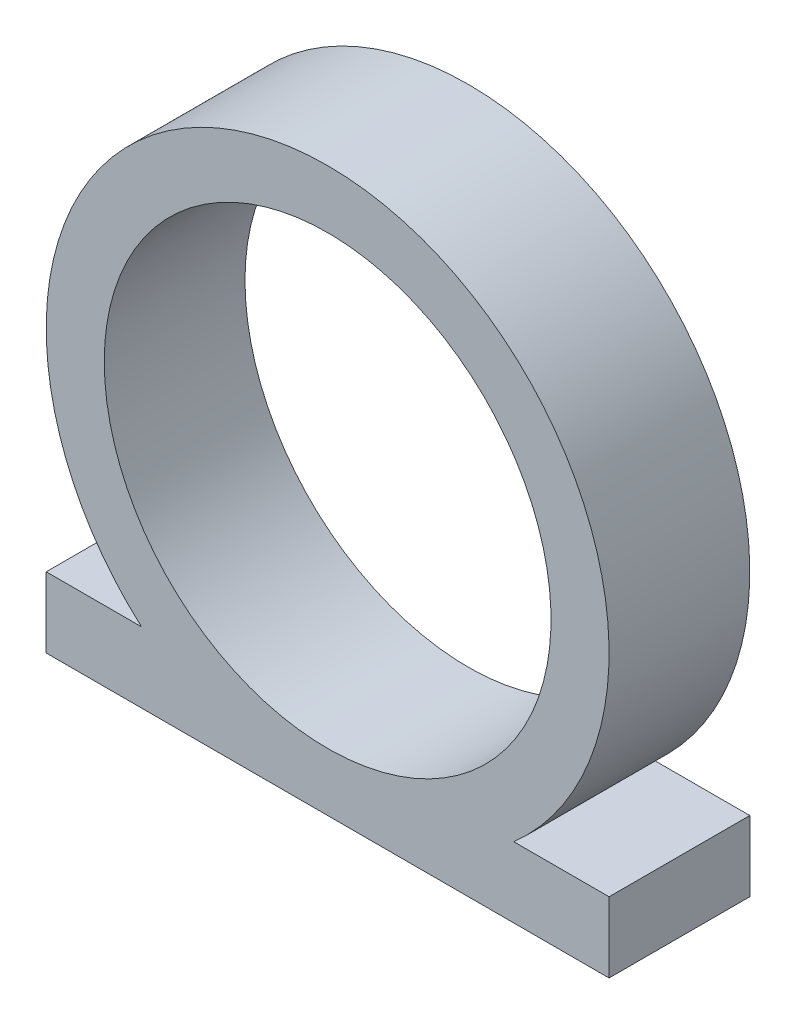
ISO-10303-21;
HEADER;
FILE_DESCRIPTION(('STEP AP214'),'2;1');
FILE_NAME('part.step','',(''),(''),'','','');
FILE_SCHEMA(('AUTOMOTIVE_DESIGN { 1 0 10303 214 1 1 1 1 }'));
ENDSEC;
DATA;
#1=APPLICATION_CONTEXT('core data for automotive mechanical design processes');
#2=APPLICATION_PROTOCOL_DEFINITION('international standard','automotive_design',2000,#1);
#3=PRODUCT_CONTEXT('',#1,'mechanical');
#4=PRODUCT('Part','Part','',(#3));
#5=PRODUCT_RELATED_PRODUCT_CATEGORY('part','',(#4));
#6=PRODUCT_DEFINITION_FORMATION('','',#4);
#7=PRODUCT_DEFINITION_CONTEXT('part definition',#1,'design');
#8=PRODUCT_DEFINITION('design','',#6,#7);
#9=PRODUCT_DEFINITION_SHAPE('','',#8);
#10=(LENGTH_UNIT() NAMED_UNIT(*) SI_UNIT(.MILLI.,.METRE.));
#11=(NAMED_UNIT(*) PLANE_ANGLE_UNIT() SI_UNIT($,.RADIAN.));
#12=(NAMED_UNIT(*) SI_UNIT($,.STERADIAN.) SOLID_ANGLE_UNIT());
#13=UNCERTAINTY_MEASURE_WITH_UNIT(LENGTH_MEASURE(1.E-05),#10,'distance_accuracy_value','');
#14=(GEOMETRIC_REPRESENTATION_CONTEXT(3) GLOBAL_UNCERTAINTY_ASSIGNED_CONTEXT((#13)) GLOBAL_UNIT_ASSIGNED_CONTEXT((#10,
#11,#12)) REPRESENTATION_CONTEXT('',''));
#15=CARTESIAN_POINT('',(0.,0.,0.));
#16=DIRECTION('',(0.,0.,1.));
#17=DIRECTION('',(1.,0.,0.));
#18=AXIS2_PLACEMENT_3D('',#15,#16,#17);
#19=CARTESIAN_POINT('',(0.,0.,10.));
#20=DIRECTION('',(0.,0.,-1.));
#21=DIRECTION('',(-1.,0.,0.));
#22=AXIS2_PLACEMENT_3D('',#19,#20,#21);
#23=CYLINDRICAL_SURFACE('',#22,20.);
#24=CARTESIAN_POINT('',(0.,0.,10.));
#25=DIRECTION('',(0.,0.,1.));
#26=DIRECTION('',(1.,0.,0.));
#27=AXIS2_PLACEMENT_3D('',#24,#25,#26);
#28=CIRCLE('',#27,20.);
#29=CARTESIAN_POINT('',(13.228756555323,-15.,10.));
#30=VERTEX_POINT('',#29);
#31=CARTESIAN_POINT('',(-13.228756555323,-15.,10.));
#32=VERTEX_POINT('',#31);
#33=EDGE_CURVE('E11',#30,#32,#28,.T.);
#34=ORIENTED_EDGE('',*,*,#33,.F.);
#35=DIRECTION('',(0.,0.,-1.));
#36=VECTOR('',#35,1.);
#37=CARTESIAN_POINT('',(13.228756555323,-15.,10.));
#38=LINE('',#37,#36);
#39=CARTESIAN_POINT('',(13.228756555323,-15.,0.));
#40=VERTEX_POINT('',#39);
#41=EDGE_CURVE('E132',#30,#40,#38,.T.);
#42=ORIENTED_EDGE('',*,*,#41,.T.);
#43=CARTESIAN_POINT('',(0.,0.,0.));
#44=DIRECTION('',(0.,0.,1.));
#45=DIRECTION('',(1.,0.,0.));
#46=AXIS2_PLACEMENT_3D('',#43,#44,#45);
#47=CIRCLE('',#46,20.);
#48=CARTESIAN_POINT('',(-13.228756555323,-15.,0.));
#49=VERTEX_POINT('',#48);
#50=EDGE_CURVE('E36',#40,#49,#47,.T.);
#51=ORIENTED_EDGE('',*,*,#50,.T.);
#52=DIRECTION('',(0.,0.,-1.));
#53=VECTOR('',#52,1.);
#54=CARTESIAN_POINT('',(-13.228756555323,-15.,10.));
#55=LINE('',#54,#53);
#56=EDGE_CURVE('E50',#49,#32,#55,.F.);
#57=ORIENTED_EDGE('',*,*,#56,.T.);
#58=EDGE_LOOP('',(#34,#42,#51,#57));
#59=FACE_BOUND('',#58,.T.);
#60=ADVANCED_FACE('F33',(#59),#23,.T.);
#61=CARTESIAN_POINT('',(0.,0.,10.));
#62=DIRECTION('',(0.,0.,1.));
#63=DIRECTION('',(1.,0.,0.));
#64=AXIS2_PLACEMENT_3D('',#61,#62,#63);
#65=PLANE('',#64);
#66=CARTESIAN_POINT('',(0.,0.,10.));
#67=DIRECTION('',(0.,0.,-1.));
#68=DIRECTION('',(-1.,0.,0.));
#69=AXIS2_PLACEMENT_3D('',#66,#67,#68);
#70=CIRCLE('',#69,15.875);
#71=CARTESIAN_POINT('',(-15.875,0.,10.));
#72=VERTEX_POINT('',#71);
#73=EDGE_CURVE('E121',#72,#72,#70,.T.);
#74=ORIENTED_EDGE('',*,*,#73,.T.);
#75=EDGE_LOOP('',(#74));
#76=FACE_BOUND('',#75,.T.);
#77=ORIENTED_EDGE('',*,*,#33,.T.);
#78=DIRECTION('',(1.,0.,0.));
#79=VECTOR('',#78,1.);
#80=CARTESIAN_POINT('',(-20.,-15.,10.));
#81=LINE('',#80,#79);
#82=CARTESIAN_POINT('',(-20.,-15.,10.));
#83=VERTEX_POINT('',#82);
#84=EDGE_CURVE('E85',#83,#32,#81,.T.);
#85=ORIENTED_EDGE('',*,*,#84,.F.);
#86=DIRECTION('',(0.,1.,0.));
#87=VECTOR('',#86,1.);
#88=CARTESIAN_POINT('',(-20.,-15.,10.));
#89=LINE('',#88,#87);
#90=CARTESIAN_POINT('',(-20.,-20.,10.));
#91=VERTEX_POINT('',#90);
#92=EDGE_CURVE('E98',#91,#83,#89,.T.);
#93=ORIENTED_EDGE('',*,*,#92,.F.);
#94=DIRECTION('',(-1.,0.,0.));
#95=VECTOR('',#94,1.);
#96=CARTESIAN_POINT('',(-20.,-20.,10.));
#97=LINE('',#96,#95);
#98=CARTESIAN_POINT('',(20.,-20.,10.));
#99=VERTEX_POINT('',#98);
#100=EDGE_CURVE('E93',#99,#91,#97,.T.);
#101=ORIENTED_EDGE('',*,*,#100,.F.);
#102=DIRECTION('',(0.,-1.,0.));
#103=VECTOR('',#102,1.);
#104=CARTESIAN_POINT('',(20.,-15.,10.));
#105=LINE('',#104,#103);
#106=CARTESIAN_POINT('',(20.,-15.,10.));
#107=VERTEX_POINT('',#106);
#108=EDGE_CURVE('E100',#107,#99,#105,.T.);
#109=ORIENTED_EDGE('',*,*,#108,.F.);
#110=EDGE_CURVE('E101',#30,#107,#81,.T.);
#111=ORIENTED_EDGE('',*,*,#110,.F.);
#112=EDGE_LOOP('',(#77,#85,#93,#101,#109,#111));
#113=FACE_BOUND('',#112,.T.);
#114=ADVANCED_FACE('F97',(#76,#113),#65,.T.);
#115=CARTESIAN_POINT('',(0.,0.,0.));
#116=DIRECTION('',(0.,0.,1.));
#117=DIRECTION('',(1.,0.,0.));
#118=AXIS2_PLACEMENT_3D('',#115,#116,#117);
#119=PLANE('',#118);
#120=CARTESIAN_POINT('',(0.,0.,0.));
#121=DIRECTION('',(0.,0.,-1.));
#122=DIRECTION('',(-1.,0.,0.));
#123=AXIS2_PLACEMENT_3D('',#120,#121,#122);
#124=CIRCLE('',#123,15.875);
#125=CARTESIAN_POINT('',(-15.875,0.,0.));
#126=VERTEX_POINT('',#125);
#127=EDGE_CURVE('E112',#126,#126,#124,.T.);
#128=ORIENTED_EDGE('',*,*,#127,.F.);
#129=EDGE_LOOP('',(#128));
#130=FACE_BOUND('',#129,.T.);
#131=ORIENTED_EDGE('',*,*,#50,.F.);
#132=DIRECTION('',(1.,0.,0.));
#133=VECTOR('',#132,1.);
#134=CARTESIAN_POINT('',(-20.,-15.,0.));
#135=LINE('',#134,#133);
#136=CARTESIAN_POINT('',(20.,-15.,0.));
#137=VERTEX_POINT('',#136);
#138=EDGE_CURVE('E120',#40,#137,#135,.T.);
#139=ORIENTED_EDGE('',*,*,#138,.T.);
#140=DIRECTION('',(0.,-1.,0.));
#141=VECTOR('',#140,1.);
#142=CARTESIAN_POINT('',(20.,-15.,0.));
#143=LINE('',#142,#141);
#144=CARTESIAN_POINT('',(20.,-20.,0.));
#145=VERTEX_POINT('',#144);
#146=EDGE_CURVE('E109',#137,#145,#143,.T.);
#147=ORIENTED_EDGE('',*,*,#146,.T.);
#148=DIRECTION('',(-1.,0.,0.));
#149=VECTOR('',#148,1.);
#150=CARTESIAN_POINT('',(-20.,-20.,0.));
#151=LINE('',#150,#149);
#152=CARTESIAN_POINT('',(-20.,-20.,0.));
#153=VERTEX_POINT('',#152);
#154=EDGE_CURVE('E107',#145,#153,#151,.T.);
#155=ORIENTED_EDGE('',*,*,#154,.T.);
#156=DIRECTION('',(0.,1.,0.));
#157=VECTOR('',#156,1.);
#158=CARTESIAN_POINT('',(-20.,-15.,0.));
#159=LINE('',#158,#157);
#160=CARTESIAN_POINT('',(-20.,-15.,0.));
#161=VERTEX_POINT('',#160);
#162=EDGE_CURVE('E118',#153,#161,#159,.T.);
#163=ORIENTED_EDGE('',*,*,#162,.T.);
#164=EDGE_CURVE('E87',#161,#49,#135,.T.);
#165=ORIENTED_EDGE('',*,*,#164,.T.);
#166=EDGE_LOOP('',(#131,#139,#147,#155,#163,#165));
#167=FACE_BOUND('',#166,.T.);
#168=ADVANCED_FACE('F135',(#130,#167),#119,.F.);
#169=CARTESIAN_POINT('',(-20.,-20.,10.));
#170=DIRECTION('',(0.,-1.,0.));
#171=DIRECTION('',(1.,0.,0.));
#172=AXIS2_PLACEMENT_3D('',#169,#170,#171);
#173=PLANE('',#172);
#174=ORIENTED_EDGE('',*,*,#154,.F.);
#175=DIRECTION('',(0.,0.,-1.));
#176=VECTOR('',#175,1.);
#177=CARTESIAN_POINT('',(20.,-20.,10.));
#178=LINE('',#177,#176);
#179=EDGE_CURVE('E126',#99,#145,#178,.T.);
#180=ORIENTED_EDGE('',*,*,#179,.F.);
#181=ORIENTED_EDGE('',*,*,#100,.T.);
#182=DIRECTION('',(0.,0.,-1.));
#183=VECTOR('',#182,1.);
#184=CARTESIAN_POINT('',(-20.,-20.,10.));
#185=LINE('',#184,#183);
#186=EDGE_CURVE('E106',#91,#153,#185,.T.);
#187=ORIENTED_EDGE('',*,*,#186,.T.);
#188=EDGE_LOOP('',(#174,#180,#181,#187));
#189=FACE_BOUND('',#188,.T.);
#190=ADVANCED_FACE('F139',(#189),#173,.T.);
#191=CARTESIAN_POINT('',(-20.,-15.,10.));
#192=DIRECTION('',(0.,1.,0.));
#193=DIRECTION('',(-1.,0.,0.));
#194=AXIS2_PLACEMENT_3D('',#191,#192,#193);
#195=PLANE('',#194);
#196=ORIENTED_EDGE('',*,*,#41,.F.);
#197=ORIENTED_EDGE('',*,*,#110,.T.);
#198=DIRECTION('',(0.,0.,-1.));
#199=VECTOR('',#198,1.);
#200=CARTESIAN_POINT('',(20.,-15.,10.));
#201=LINE('',#200,#199);
#202=EDGE_CURVE('E92',#107,#137,#201,.T.);
#203=ORIENTED_EDGE('',*,*,#202,.T.);
#204=ORIENTED_EDGE('',*,*,#138,.F.);
#205=EDGE_LOOP('',(#196,#197,#203,#204));
#206=FACE_BOUND('',#205,.T.);
#207=ADVANCED_FACE('F145',(#206),#195,.T.);
#208=ORIENTED_EDGE('',*,*,#56,.F.);
#209=ORIENTED_EDGE('',*,*,#164,.F.);
#210=DIRECTION('',(0.,0.,-1.));
#211=VECTOR('',#210,1.);
#212=CARTESIAN_POINT('',(-20.,-15.,10.));
#213=LINE('',#212,#211);
#214=EDGE_CURVE('E82',#83,#161,#213,.T.);
#215=ORIENTED_EDGE('',*,*,#214,.F.);
#216=ORIENTED_EDGE('',*,*,#84,.T.);
#217=EDGE_LOOP('',(#208,#209,#215,#216));
#218=FACE_BOUND('',#217,.T.);
#219=ADVANCED_FACE('F84',(#218),#195,.T.);
#220=CARTESIAN_POINT('',(-20.,-15.,10.));
#221=DIRECTION('',(-1.,0.,0.));
#222=DIRECTION('',(0.,0.,1.));
#223=AXIS2_PLACEMENT_3D('',#220,#221,#222);
#224=PLANE('',#223);
#225=ORIENTED_EDGE('',*,*,#162,.F.);
#226=ORIENTED_EDGE('',*,*,#186,.F.);
#227=ORIENTED_EDGE('',*,*,#92,.T.);
#228=ORIENTED_EDGE('',*,*,#214,.T.);
#229=EDGE_LOOP('',(#225,#226,#227,#228));
#230=FACE_BOUND('',#229,.T.);
#231=ADVANCED_FACE('F104',(#230),#224,.T.);
#232=CARTESIAN_POINT('',(20.,-15.,10.));
#233=DIRECTION('',(1.,0.,0.));
#234=DIRECTION('',(0.,1.,0.));
#235=AXIS2_PLACEMENT_3D('',#232,#233,#234);
#236=PLANE('',#235);
#237=ORIENTED_EDGE('',*,*,#146,.F.);
#238=ORIENTED_EDGE('',*,*,#202,.F.);
#239=ORIENTED_EDGE('',*,*,#108,.T.);
#240=ORIENTED_EDGE('',*,*,#179,.T.);
#241=EDGE_LOOP('',(#237,#238,#239,#240));
#242=FACE_BOUND('',#241,.T.);
#243=ADVANCED_FACE('F143',(#242),#236,.T.);
#244=CARTESIAN_POINT('',(0.,0.,10.));
#245=DIRECTION('',(0.,0.,-1.));
#246=DIRECTION('',(-1.,0.,0.));
#247=AXIS2_PLACEMENT_3D('',#244,#245,#246);
#248=CYLINDRICAL_SURFACE('',#247,15.875);
#249=ORIENTED_EDGE('',*,*,#73,.F.);
#250=EDGE_LOOP('',(#249));
#251=FACE_BOUND('',#250,.T.);
#252=ORIENTED_EDGE('',*,*,#127,.T.);
#253=EDGE_LOOP('',(#252));
#254=FACE_BOUND('',#253,.T.);
#255=ADVANCED_FACE('F170',(#251,#254),#248,.F.);
#256=CLOSED_SHELL('',(#60,#114,#168,#190,#207,#219,#231,#243,#255));
#257=MANIFOLD_SOLID_BREP('B2',#256);
#258=ADVANCED_BREP_SHAPE_REPRESENTATION('',(#18,#257),#14);
#259=SHAPE_DEFINITION_REPRESENTATION(#9,#258);
ENDSEC;
END-ISO-10303-21;
